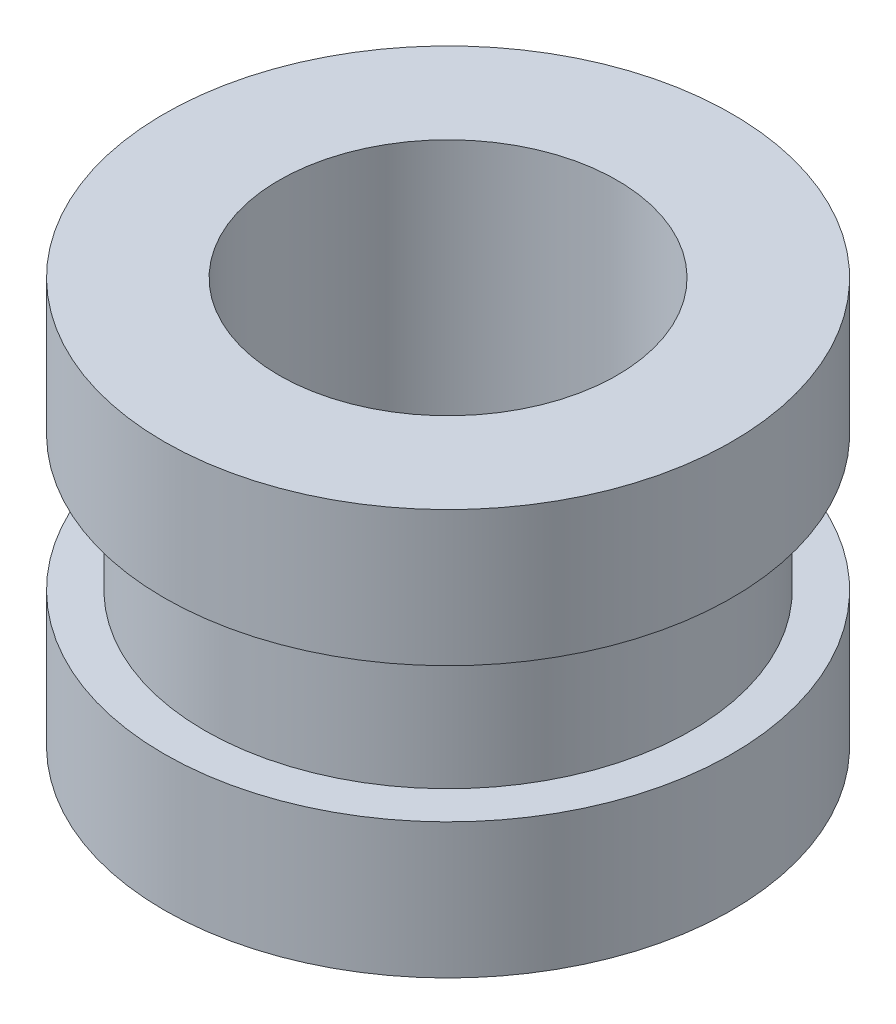
ISO-10303-21;
HEADER;
FILE_DESCRIPTION(('STEP AP214'),'2;1');
FILE_NAME('part.step','',(''),(''),'','','');
FILE_SCHEMA(('AUTOMOTIVE_DESIGN { 1 0 10303 214 1 1 1 1 }'));
ENDSEC;
DATA;
#1=APPLICATION_CONTEXT('core data for automotive mechanical design processes');
#2=APPLICATION_PROTOCOL_DEFINITION('international standard','automotive_design',2000,#1);
#3=PRODUCT_CONTEXT('',#1,'mechanical');
#4=PRODUCT('Part','Part','',(#3));
#5=PRODUCT_RELATED_PRODUCT_CATEGORY('part','',(#4));
#6=PRODUCT_DEFINITION_FORMATION('','',#4);
#7=PRODUCT_DEFINITION_CONTEXT('part definition',#1,'design');
#8=PRODUCT_DEFINITION('design','',#6,#7);
#9=PRODUCT_DEFINITION_SHAPE('','',#8);
#10=(LENGTH_UNIT() NAMED_UNIT(*) SI_UNIT(.MILLI.,.METRE.));
#11=(NAMED_UNIT(*) PLANE_ANGLE_UNIT() SI_UNIT($,.RADIAN.));
#12=(NAMED_UNIT(*) SI_UNIT($,.STERADIAN.) SOLID_ANGLE_UNIT());
#13=UNCERTAINTY_MEASURE_WITH_UNIT(LENGTH_MEASURE(1.E-05),#10,'distance_accuracy_value','');
#14=(GEOMETRIC_REPRESENTATION_CONTEXT(3) GLOBAL_UNCERTAINTY_ASSIGNED_CONTEXT((#13)) GLOBAL_UNIT_ASSIGNED_CONTEXT((#10,
#11,#12)) REPRESENTATION_CONTEXT('',''));
#15=CARTESIAN_POINT('',(0.,0.,0.));
#16=DIRECTION('',(0.,0.,1.));
#17=DIRECTION('',(1.,0.,0.));
#18=AXIS2_PLACEMENT_3D('',#15,#16,#17);
#19=CARTESIAN_POINT('',(0.,1.,0.));
#20=DIRECTION('',(0.,-1.,0.));
#21=DIRECTION('',(0.,0.,-1.));
#22=AXIS2_PLACEMENT_3D('',#19,#20,#21);
#23=CYLINDRICAL_SURFACE('',#22,2.1);
#24=CARTESIAN_POINT('',(0.,1.,0.));
#25=DIRECTION('',(0.,1.,0.));
#26=DIRECTION('',(0.,0.,1.));
#27=AXIS2_PLACEMENT_3D('',#24,#25,#26);
#28=CIRCLE('',#27,2.1);
#29=CARTESIAN_POINT('',(0.,1.,2.1));
#30=VERTEX_POINT('',#29);
#31=EDGE_CURVE('E45',#30,#30,#28,.T.);
#32=ORIENTED_EDGE('',*,*,#31,.F.);
#33=EDGE_LOOP('',(#32));
#34=FACE_BOUND('',#33,.T.);
#35=CARTESIAN_POINT('',(0.,0.,0.));
#36=DIRECTION('',(0.,1.,0.));
#37=DIRECTION('',(0.,0.,1.));
#38=AXIS2_PLACEMENT_3D('',#35,#36,#37);
#39=CIRCLE('',#38,2.1);
#40=CARTESIAN_POINT('',(0.,0.,2.1));
#41=VERTEX_POINT('',#40);
#42=EDGE_CURVE('E41',#41,#41,#39,.T.);
#43=ORIENTED_EDGE('',*,*,#42,.T.);
#44=EDGE_LOOP('',(#43));
#45=FACE_BOUND('',#44,.T.);
#46=ADVANCED_FACE('F38',(#34,#45),#23,.T.);
#47=CARTESIAN_POINT('',(0.,1.,0.));
#48=DIRECTION('',(0.,1.,0.));
#49=DIRECTION('',(0.,0.,1.));
#50=AXIS2_PLACEMENT_3D('',#47,#48,#49);
#51=PLANE('',#50);
#52=CARTESIAN_POINT('',(0.,1.,0.));
#53=DIRECTION('',(0.,1.,0.));
#54=DIRECTION('',(0.,0.,1.));
#55=AXIS2_PLACEMENT_3D('',#52,#53,#54);
#56=CIRCLE('',#55,1.8);
#57=CARTESIAN_POINT('',(0.,1.,1.8));
#58=VERTEX_POINT('',#57);
#59=EDGE_CURVE('E10',#58,#58,#56,.T.);
#60=ORIENTED_EDGE('',*,*,#59,.F.);
#61=EDGE_LOOP('',(#60));
#62=FACE_BOUND('',#61,.T.);
#63=ORIENTED_EDGE('',*,*,#31,.T.);
#64=EDGE_LOOP('',(#63));
#65=FACE_BOUND('',#64,.T.);
#66=ADVANCED_FACE('F92',(#62,#65),#51,.T.);
#67=CARTESIAN_POINT('',(0.,0.,0.));
#68=DIRECTION('',(0.,1.,0.));
#69=DIRECTION('',(0.,0.,1.));
#70=AXIS2_PLACEMENT_3D('',#67,#68,#69);
#71=PLANE('',#70);
#72=CARTESIAN_POINT('',(0.,0.,0.));
#73=DIRECTION('',(0.,1.,0.));
#74=DIRECTION('',(0.,0.,1.));
#75=AXIS2_PLACEMENT_3D('',#72,#73,#74);
#76=CIRCLE('',#75,1.25);
#77=CARTESIAN_POINT('',(0.,0.,1.25));
#78=VERTEX_POINT('',#77);
#79=EDGE_CURVE('E58',#78,#78,#76,.T.);
#80=ORIENTED_EDGE('',*,*,#79,.T.);
#81=EDGE_LOOP('',(#80));
#82=FACE_BOUND('',#81,.T.);
#83=ORIENTED_EDGE('',*,*,#42,.F.);
#84=EDGE_LOOP('',(#83));
#85=FACE_BOUND('',#84,.T.);
#86=ADVANCED_FACE('F97',(#82,#85),#71,.F.);
#87=CARTESIAN_POINT('',(0.,2.,0.));
#88=DIRECTION('',(0.,-1.,0.));
#89=DIRECTION('',(0.,0.,-1.));
#90=AXIS2_PLACEMENT_3D('',#87,#88,#89);
#91=CYLINDRICAL_SURFACE('',#90,1.8);
#92=CARTESIAN_POINT('',(0.,2.,0.));
#93=DIRECTION('',(0.,1.,0.));
#94=DIRECTION('',(0.,0.,1.));
#95=AXIS2_PLACEMENT_3D('',#92,#93,#94);
#96=CIRCLE('',#95,1.8);
#97=CARTESIAN_POINT('',(0.,2.,1.8));
#98=VERTEX_POINT('',#97);
#99=EDGE_CURVE('E51',#98,#98,#96,.T.);
#100=ORIENTED_EDGE('',*,*,#99,.F.);
#101=EDGE_LOOP('',(#100));
#102=FACE_BOUND('',#101,.T.);
#103=ORIENTED_EDGE('',*,*,#59,.T.);
#104=EDGE_LOOP('',(#103));
#105=FACE_BOUND('',#104,.T.);
#106=ADVANCED_FACE('F79',(#102,#105),#91,.T.);
#107=CARTESIAN_POINT('',(0.,3.,0.));
#108=DIRECTION('',(0.,-1.,0.));
#109=DIRECTION('',(0.,0.,-1.));
#110=AXIS2_PLACEMENT_3D('',#107,#108,#109);
#111=CYLINDRICAL_SURFACE('',#110,2.1);
#112=CARTESIAN_POINT('',(0.,3.,0.));
#113=DIRECTION('',(0.,1.,0.));
#114=DIRECTION('',(0.,0.,1.));
#115=AXIS2_PLACEMENT_3D('',#112,#113,#114);
#116=CIRCLE('',#115,2.1);
#117=CARTESIAN_POINT('',(0.,3.,2.1));
#118=VERTEX_POINT('',#117);
#119=EDGE_CURVE('E54',#118,#118,#116,.T.);
#120=ORIENTED_EDGE('',*,*,#119,.F.);
#121=EDGE_LOOP('',(#120));
#122=FACE_BOUND('',#121,.T.);
#123=CARTESIAN_POINT('',(0.,2.,0.));
#124=DIRECTION('',(0.,1.,0.));
#125=DIRECTION('',(0.,0.,1.));
#126=AXIS2_PLACEMENT_3D('',#123,#124,#125);
#127=CIRCLE('',#126,2.1);
#128=CARTESIAN_POINT('',(0.,2.,2.1));
#129=VERTEX_POINT('',#128);
#130=EDGE_CURVE('E55',#129,#129,#127,.T.);
#131=ORIENTED_EDGE('',*,*,#130,.T.);
#132=EDGE_LOOP('',(#131));
#133=FACE_BOUND('',#132,.T.);
#134=ADVANCED_FACE('F73',(#122,#133),#111,.T.);
#135=CARTESIAN_POINT('',(0.,3.,0.));
#136=DIRECTION('',(0.,1.,0.));
#137=DIRECTION('',(0.,0.,1.));
#138=AXIS2_PLACEMENT_3D('',#135,#136,#137);
#139=PLANE('',#138);
#140=CARTESIAN_POINT('',(0.,3.,0.));
#141=DIRECTION('',(0.,1.,0.));
#142=DIRECTION('',(0.,0.,1.));
#143=AXIS2_PLACEMENT_3D('',#140,#141,#142);
#144=CIRCLE('',#143,1.25);
#145=CARTESIAN_POINT('',(0.,3.,1.25));
#146=VERTEX_POINT('',#145);
#147=EDGE_CURVE('E63',#146,#146,#144,.T.);
#148=ORIENTED_EDGE('',*,*,#147,.F.);
#149=EDGE_LOOP('',(#148));
#150=FACE_BOUND('',#149,.T.);
#151=ORIENTED_EDGE('',*,*,#119,.T.);
#152=EDGE_LOOP('',(#151));
#153=FACE_BOUND('',#152,.T.);
#154=ADVANCED_FACE('F69',(#150,#153),#139,.T.);
#155=CARTESIAN_POINT('',(0.,2.,0.));
#156=DIRECTION('',(0.,1.,0.));
#157=DIRECTION('',(0.,0.,1.));
#158=AXIS2_PLACEMENT_3D('',#155,#156,#157);
#159=PLANE('',#158);
#160=ORIENTED_EDGE('',*,*,#99,.T.);
#161=EDGE_LOOP('',(#160));
#162=FACE_BOUND('',#161,.T.);
#163=ORIENTED_EDGE('',*,*,#130,.F.);
#164=EDGE_LOOP('',(#163));
#165=FACE_BOUND('',#164,.T.);
#166=ADVANCED_FACE('F72',(#162,#165),#159,.F.);
#167=CARTESIAN_POINT('',(0.,3.,0.));
#168=DIRECTION('',(0.,1.,0.));
#169=DIRECTION('',(0.,0.,1.));
#170=AXIS2_PLACEMENT_3D('',#167,#168,#169);
#171=CYLINDRICAL_SURFACE('',#170,1.25);
#172=ORIENTED_EDGE('',*,*,#79,.F.);
#173=EDGE_LOOP('',(#172));
#174=FACE_BOUND('',#173,.T.);
#175=ORIENTED_EDGE('',*,*,#147,.T.);
#176=EDGE_LOOP('',(#175));
#177=FACE_BOUND('',#176,.T.);
#178=ADVANCED_FACE('F67',(#174,#177),#171,.F.);
#179=CLOSED_SHELL('',(#46,#66,#86,#106,#134,#154,#166,#178));
#180=MANIFOLD_SOLID_BREP('B2',#179);
#181=ADVANCED_BREP_SHAPE_REPRESENTATION('',(#18,#180),#14);
#182=SHAPE_DEFINITION_REPRESENTATION(#9,#181);
ENDSEC;
END-ISO-10303-21;
